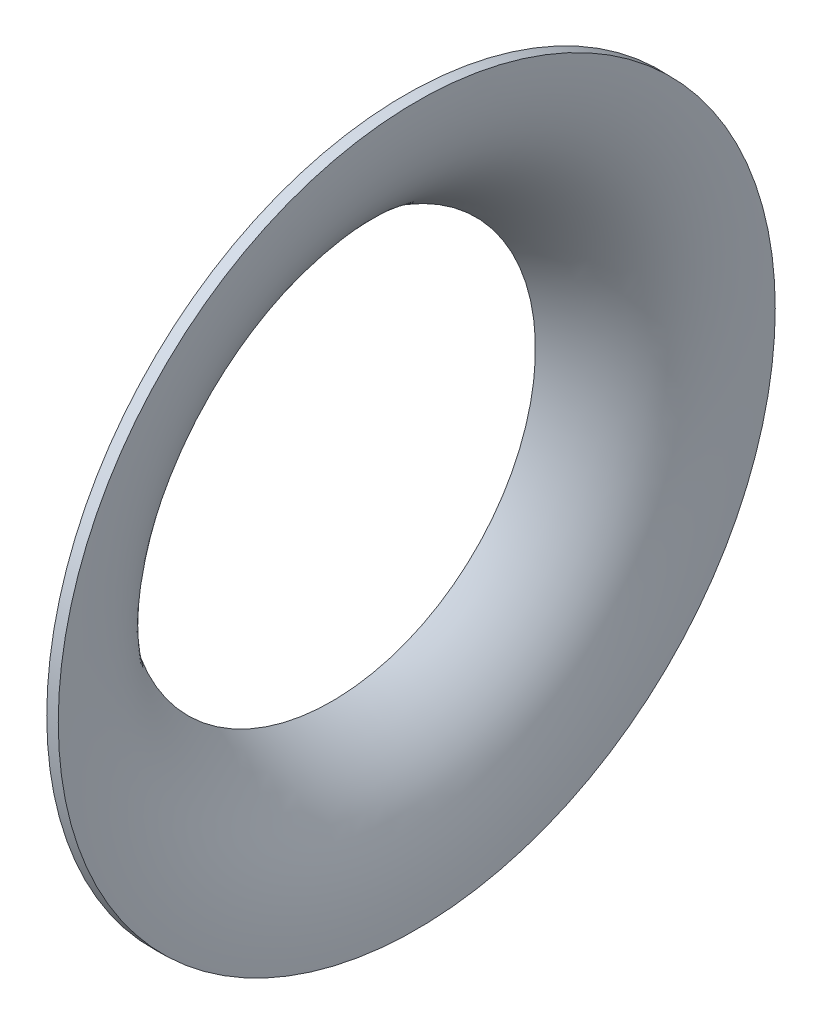
ISO-10303-21;
HEADER;
FILE_DESCRIPTION(('STEP AP214'),'2;1');
FILE_NAME('part.step','',(''),(''),'','','');
FILE_SCHEMA(('AUTOMOTIVE_DESIGN { 1 0 10303 214 1 1 1 1 }'));
ENDSEC;
DATA;
#1=APPLICATION_CONTEXT('core data for automotive mechanical design processes');
#2=APPLICATION_PROTOCOL_DEFINITION('international standard','automotive_design',2000,#1);
#3=PRODUCT_CONTEXT('',#1,'mechanical');
#4=PRODUCT('Part','Part','',(#3));
#5=PRODUCT_RELATED_PRODUCT_CATEGORY('part','',(#4));
#6=PRODUCT_DEFINITION_FORMATION('','',#4);
#7=PRODUCT_DEFINITION_CONTEXT('part definition',#1,'design');
#8=PRODUCT_DEFINITION('design','',#6,#7);
#9=PRODUCT_DEFINITION_SHAPE('','',#8);
#10=(LENGTH_UNIT() NAMED_UNIT(*) SI_UNIT(.MILLI.,.METRE.));
#11=(NAMED_UNIT(*) PLANE_ANGLE_UNIT() SI_UNIT($,.RADIAN.));
#12=(NAMED_UNIT(*) SI_UNIT($,.STERADIAN.) SOLID_ANGLE_UNIT());
#13=UNCERTAINTY_MEASURE_WITH_UNIT(LENGTH_MEASURE(1.E-05),#10,'distance_accuracy_value','');
#14=(GEOMETRIC_REPRESENTATION_CONTEXT(3) GLOBAL_UNCERTAINTY_ASSIGNED_CONTEXT((#13)) GLOBAL_UNIT_ASSIGNED_CONTEXT((#10,
#11,#12)) REPRESENTATION_CONTEXT('',''));
#15=CARTESIAN_POINT('',(0.,0.,0.));
#16=DIRECTION('',(0.,0.,1.));
#17=DIRECTION('',(1.,0.,0.));
#18=AXIS2_PLACEMENT_3D('',#15,#16,#17);
#19=CARTESIAN_POINT('',(-27.22,53.64,0.));
#20=CARTESIAN_POINT('',(-20.143379633805,57.8378479712018,0.));
#21=CARTESIAN_POINT('',(-6.83379815551488,69.5675092158712,0.));
#22=CARTESIAN_POINT('',(-4.93497697794858,86.2377130865872,0.));
#23=CARTESIAN_POINT('',(-4.85,94.45,0.));
#24=B_SPLINE_CURVE_WITH_KNOTS('',3,(#19,#20,#21,#22,#23),.UNSPECIFIED.,.F.,.F.,(4,1,4),(0.,
0.32174714943046,0.623046653222843),.UNSPECIFIED.);
#25=CARTESIAN_POINT('',(-71.7859039778834,0.,0.));
#26=DIRECTION('',(-1.,0.,0.));
#27=AXIS1_PLACEMENT('',#25,#26);
#28=SURFACE_OF_REVOLUTION('',#24,#27);
#29=CARTESIAN_POINT('',(-4.84999999999999,0.,0.));
#30=DIRECTION('',(-1.,0.,0.));
#31=DIRECTION('',(0.,0.,1.));
#32=AXIS2_PLACEMENT_3D('',#29,#30,#31);
#33=CIRCLE('',#32,94.45);
#34=CARTESIAN_POINT('',(-4.84999999999999,0.,94.45));
#35=VERTEX_POINT('',#34);
#36=EDGE_CURVE('E57',#35,#35,#33,.T.);
#37=ORIENTED_EDGE('',*,*,#36,.F.);
#38=EDGE_LOOP('',(#37));
#39=FACE_BOUND('',#38,.T.);
#40=CARTESIAN_POINT('',(-27.22,0.,0.));
#41=DIRECTION('',(-1.,0.,0.));
#42=DIRECTION('',(0.,0.,1.));
#43=AXIS2_PLACEMENT_3D('',#40,#41,#42);
#44=CIRCLE('',#43,53.64);
#45=CARTESIAN_POINT('',(-27.22,0.,53.64));
#46=VERTEX_POINT('',#45);
#47=EDGE_CURVE('E10',#46,#46,#44,.T.);
#48=ORIENTED_EDGE('',*,*,#47,.T.);
#49=EDGE_LOOP('',(#48));
#50=FACE_BOUND('',#49,.T.);
#51=ADVANCED_FACE('F41',(#39,#50),#28,.T.);
#52=CARTESIAN_POINT('',(-27.22,0.,0.));
#53=DIRECTION('',(-1.,0.,0.));
#54=DIRECTION('',(0.,0.,1.));
#55=AXIS2_PLACEMENT_3D('',#52,#53,#54);
#56=CONICAL_SURFACE('',#55,53.64,1.03539216724558);
#57=CARTESIAN_POINT('',(-28.7505660506823,0.,0.));
#58=DIRECTION('',(-1.,0.,0.));
#59=DIRECTION('',(0.,0.,1.));
#60=AXIS2_PLACEMENT_3D('',#57,#58,#59);
#61=CIRCLE('',#60,56.2201875056861);
#62=CARTESIAN_POINT('',(-28.7505660506823,0.,56.2201875056861));
#63=VERTEX_POINT('',#62);
#64=EDGE_CURVE('E48',#63,#63,#61,.T.);
#65=ORIENTED_EDGE('',*,*,#64,.T.);
#66=EDGE_LOOP('',(#65));
#67=FACE_BOUND('',#66,.T.);
#68=ORIENTED_EDGE('',*,*,#47,.F.);
#69=EDGE_LOOP('',(#68));
#70=FACE_BOUND('',#69,.T.);
#71=ADVANCED_FACE('F75',(#67,#70),#56,.F.);
#72=CARTESIAN_POINT('',(-28.7505660506823,56.2201875056861,0.));
#73=CARTESIAN_POINT('',(-25.4970481575811,58.1501728348507,0.));
#74=CARTESIAN_POINT('',(-22.2914278913972,60.4954781879232,0.));
#75=CARTESIAN_POINT('',(-18.0560857806861,64.4970804849065,0.));
#76=CARTESIAN_POINT('',(-16.7395214463456,65.9111652652835,0.));
#77=CARTESIAN_POINT('',(-14.3732854333053,68.8724895081306,0.));
#78=CARTESIAN_POINT('',(-13.3237694882245,70.4194964184856,0.));
#79=CARTESIAN_POINT('',(-11.999972269221,72.8198770249821,0.));
#80=CARTESIAN_POINT('',(-11.6007342993957,73.6344576312442,0.));
#81=CARTESIAN_POINT('',(-10.8727515050285,75.30865178103,0.));
#82=CARTESIAN_POINT('',(-10.5448939926557,76.1659190658617,0.));
#83=CARTESIAN_POINT('',(-9.66038352324894,78.7951237645358,0.));
#84=CARTESIAN_POINT('',(-9.20288051869256,80.6248464005171,0.));
#85=CARTESIAN_POINT('',(-8.15515131495126,86.3030869188916,0.));
#86=CARTESIAN_POINT('',(-7.89268221518928,90.3406554835709,0.));
#87=CARTESIAN_POINT('',(-7.84983940548,94.4810409621213,0.));
#88=B_SPLINE_CURVE_WITH_KNOTS('',3,(#72,#73,#74,#75,#76,#77,#78,#79,#80,#81,#82,#83,#84,#85,#86,
#87),.UNSPECIFIED.,.F.,.F.,(4,2,2,2,2,2,2,4),(0.,0.249999999999999,0.374999999999999,
0.499999999999998,0.562499999999998,0.624999999999998,0.749999999999999,1.),.UNSPECIFIED.);
#89=CARTESIAN_POINT('',(-71.7859039778834,0.,0.));
#90=DIRECTION('',(-1.,0.,0.));
#91=AXIS1_PLACEMENT('',#89,#90);
#92=SURFACE_OF_REVOLUTION('',#88,#91);
#93=CARTESIAN_POINT('',(-7.84983940547999,0.,0.));
#94=DIRECTION('',(-1.,0.,0.));
#95=DIRECTION('',(0.,0.,1.));
#96=AXIS2_PLACEMENT_3D('',#93,#94,#95);
#97=CIRCLE('',#96,94.4810409621213);
#98=CARTESIAN_POINT('',(-7.84983940547999,0.,94.4810409621213));
#99=VERTEX_POINT('',#98);
#100=EDGE_CURVE('E55',#99,#99,#97,.T.);
#101=ORIENTED_EDGE('',*,*,#100,.T.);
#102=EDGE_LOOP('',(#101));
#103=FACE_BOUND('',#102,.T.);
#104=ORIENTED_EDGE('',*,*,#64,.F.);
#105=EDGE_LOOP('',(#104));
#106=FACE_BOUND('',#105,.T.);
#107=ADVANCED_FACE('F71',(#103,#106),#92,.F.);
#108=CARTESIAN_POINT('',(-7.84983940547999,0.,0.));
#109=DIRECTION('',(-1.,0.,0.));
#110=DIRECTION('',(0.,0.,1.));
#111=AXIS2_PLACEMENT_3D('',#108,#109,#110);
#112=CONICAL_SURFACE('',#111,94.4810409621213,0.0103471720076737);
#113=ORIENTED_EDGE('',*,*,#36,.T.);
#114=EDGE_LOOP('',(#113));
#115=FACE_BOUND('',#114,.T.);
#116=ORIENTED_EDGE('',*,*,#100,.F.);
#117=EDGE_LOOP('',(#116));
#118=FACE_BOUND('',#117,.T.);
#119=ADVANCED_FACE('F73',(#115,#118),#112,.T.);
#120=CLOSED_SHELL('',(#51,#71,#107,#119));
#121=MANIFOLD_SOLID_BREP('B2',#120);
#122=ADVANCED_BREP_SHAPE_REPRESENTATION('',(#18,#121),#14);
#123=SHAPE_DEFINITION_REPRESENTATION(#9,#122);
ENDSEC;
END-ISO-10303-21;
